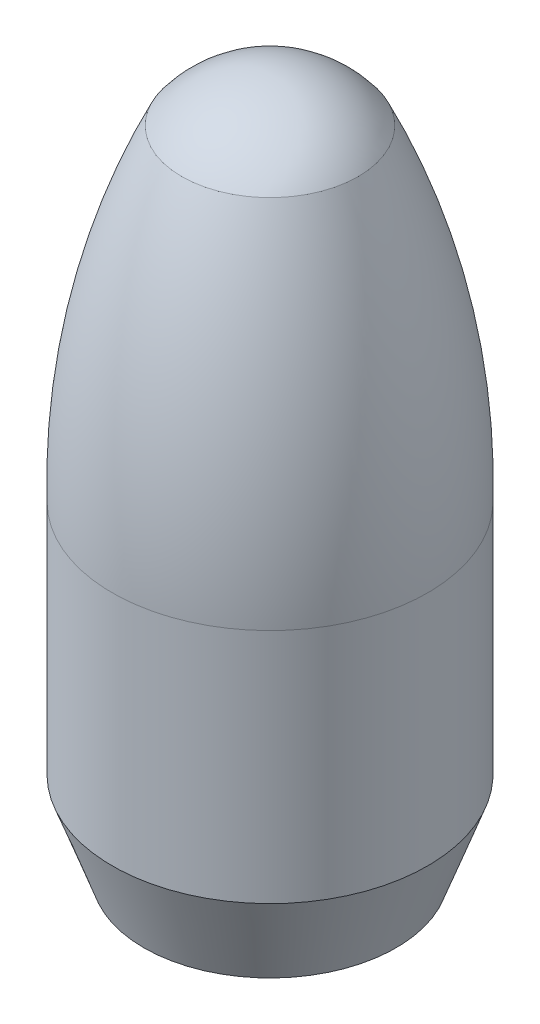
ISO-10303-21;
HEADER;
FILE_DESCRIPTION(('STEP AP214'),'2;1');
FILE_NAME('part.step','',(''),(''),'','','');
FILE_SCHEMA(('AUTOMOTIVE_DESIGN { 1 0 10303 214 1 1 1 1 }'));
ENDSEC;
DATA;
#1=APPLICATION_CONTEXT('core data for automotive mechanical design processes');
#2=APPLICATION_PROTOCOL_DEFINITION('international standard','automotive_design',2000,#1);
#3=PRODUCT_CONTEXT('',#1,'mechanical');
#4=PRODUCT('Part','Part','',(#3));
#5=PRODUCT_RELATED_PRODUCT_CATEGORY('part','',(#4));
#6=PRODUCT_DEFINITION_FORMATION('','',#4);
#7=PRODUCT_DEFINITION_CONTEXT('part definition',#1,'design');
#8=PRODUCT_DEFINITION('design','',#6,#7);
#9=PRODUCT_DEFINITION_SHAPE('','',#8);
#10=(LENGTH_UNIT() NAMED_UNIT(*) SI_UNIT(.MILLI.,.METRE.));
#11=(NAMED_UNIT(*) PLANE_ANGLE_UNIT() SI_UNIT($,.RADIAN.));
#12=(NAMED_UNIT(*) SI_UNIT($,.STERADIAN.) SOLID_ANGLE_UNIT());
#13=UNCERTAINTY_MEASURE_WITH_UNIT(LENGTH_MEASURE(1.E-05),#10,'distance_accuracy_value','');
#14=(GEOMETRIC_REPRESENTATION_CONTEXT(3) GLOBAL_UNCERTAINTY_ASSIGNED_CONTEXT((#13)) GLOBAL_UNIT_ASSIGNED_CONTEXT((#10,
#11,#12)) REPRESENTATION_CONTEXT('',''));
#15=CARTESIAN_POINT('',(0.,0.,0.));
#16=DIRECTION('',(0.,0.,1.));
#17=DIRECTION('',(1.,0.,0.));
#18=AXIS2_PLACEMENT_3D('',#15,#16,#17);
#19=CARTESIAN_POINT('',(0.,302.631585159194,0.));
#20=DIRECTION('',(0.,-1.,0.));
#21=DIRECTION('',(0.,0.,-1.));
#22=AXIS2_PLACEMENT_3D('',#19,#20,#21);
#23=DEGENERATE_TOROIDAL_SURFACE('',#22,497.392758846372,637.584406556793,.F.);
#24=CARTESIAN_POINT('',(0.,576.450091371725,0.));
#25=DIRECTION('',(0.,-1.,0.));
#26=DIRECTION('',(0.,0.,-1.));
#27=AXIS2_PLACEMENT_3D('',#24,#25,#26);
#28=CIRCLE('',#27,78.4);
#29=CARTESIAN_POINT('',(0.,576.450091371725,-78.4));
#30=VERTEX_POINT('',#29);
#31=EDGE_CURVE('E41',#30,#30,#28,.T.);
#32=ORIENTED_EDGE('',*,*,#31,.T.);
#33=EDGE_LOOP('',(#32));
#34=FACE_BOUND('',#33,.T.);
#35=CARTESIAN_POINT('',(0.,287.,0.));
#36=DIRECTION('',(0.,-1.,0.));
#37=DIRECTION('',(0.,0.,-1.));
#38=AXIS2_PLACEMENT_3D('',#35,#36,#37);
#39=CIRCLE('',#38,140.);
#40=CARTESIAN_POINT('',(0.,287.,-140.));
#41=VERTEX_POINT('',#40);
#42=EDGE_CURVE('E10',#41,#41,#39,.T.);
#43=ORIENTED_EDGE('',*,*,#42,.F.);
#44=EDGE_LOOP('',(#43));
#45=FACE_BOUND('',#44,.T.);
#46=ADVANCED_FACE('F40',(#34,#45),#23,.F.);
#47=CARTESIAN_POINT('',(0.,0.,0.));
#48=DIRECTION('',(0.,-1.,0.));
#49=DIRECTION('',(0.,0.,-1.));
#50=AXIS2_PLACEMENT_3D('',#47,#48,#49);
#51=CYLINDRICAL_SURFACE('',#50,140.);
#52=ORIENTED_EDGE('',*,*,#42,.T.);
#53=EDGE_LOOP('',(#52));
#54=FACE_BOUND('',#53,.T.);
#55=CARTESIAN_POINT('',(0.,77.,0.));
#56=DIRECTION('',(0.,-1.,0.));
#57=DIRECTION('',(0.,0.,-1.));
#58=AXIS2_PLACEMENT_3D('',#55,#56,#57);
#59=CIRCLE('',#58,140.);
#60=CARTESIAN_POINT('',(0.,77.,-140.));
#61=VERTEX_POINT('',#60);
#62=EDGE_CURVE('E44',#61,#61,#59,.T.);
#63=ORIENTED_EDGE('',*,*,#62,.F.);
#64=EDGE_LOOP('',(#63));
#65=FACE_BOUND('',#64,.T.);
#66=ADVANCED_FACE('F69',(#54,#65),#51,.T.);
#67=CARTESIAN_POINT('',(0.,0.,0.));
#68=DIRECTION('',(0.,1.,0.));
#69=DIRECTION('',(0.,0.,1.));
#70=AXIS2_PLACEMENT_3D('',#67,#68,#69);
#71=CONICAL_SURFACE('',#70,112.,0.348771003583907);
#72=ORIENTED_EDGE('',*,*,#62,.T.);
#73=EDGE_LOOP('',(#72));
#74=FACE_BOUND('',#73,.T.);
#75=CARTESIAN_POINT('',(0.,0.,0.));
#76=DIRECTION('',(0.,-1.,0.));
#77=DIRECTION('',(0.,0.,-1.));
#78=AXIS2_PLACEMENT_3D('',#75,#76,#77);
#79=CIRCLE('',#78,112.);
#80=CARTESIAN_POINT('',(0.,0.,-112.));
#81=VERTEX_POINT('',#80);
#82=EDGE_CURVE('E47',#81,#81,#79,.T.);
#83=ORIENTED_EDGE('',*,*,#82,.F.);
#84=EDGE_LOOP('',(#83));
#85=FACE_BOUND('',#84,.T.);
#86=ADVANCED_FACE('F67',(#74,#85),#71,.T.);
#87=CARTESIAN_POINT('',(0.,0.,0.));
#88=DIRECTION('',(0.,-1.,0.));
#89=DIRECTION('',(0.,0.,-1.));
#90=AXIS2_PLACEMENT_3D('',#87,#88,#89);
#91=PLANE('',#90);
#92=ORIENTED_EDGE('',*,*,#82,.T.);
#93=EDGE_LOOP('',(#92));
#94=FACE_BOUND('',#93,.T.);
#95=ADVANCED_FACE('F64',(#94),#91,.T.);
#96=CARTESIAN_POINT('',(0.,517.650091371725,0.));
#97=DIRECTION('',(0.,0.,1.));
#98=DIRECTION('',(1.,0.,0.));
#99=AXIS2_PLACEMENT_3D('',#96,#97,#98);
#100=SPHERICAL_SURFACE('',#99,98.);
#101=CARTESIAN_POINT('',(0.,517.650091371725,0.));
#102=DIRECTION('',(0.,-1.,0.));
#103=DIRECTION('',(0.,0.,-1.));
#104=AXIS2_PLACEMENT_3D('',#101,#102,#103);
#105=SPHERICAL_SURFACE('',#104,98.);
#106=ORIENTED_EDGE('',*,*,#31,.F.);
#107=EDGE_LOOP('',(#106));
#108=FACE_BOUND('',#107,.T.);
#109=ADVANCED_FACE('F39',(#108),#105,.T.);
#110=CLOSED_SHELL('',(#46,#66,#86,#95,#109));
#111=MANIFOLD_SOLID_BREP('B2',#110);
#112=ADVANCED_BREP_SHAPE_REPRESENTATION('',(#18,#111),#14);
#113=SHAPE_DEFINITION_REPRESENTATION(#9,#112);
ENDSEC;
END-ISO-10303-21;
